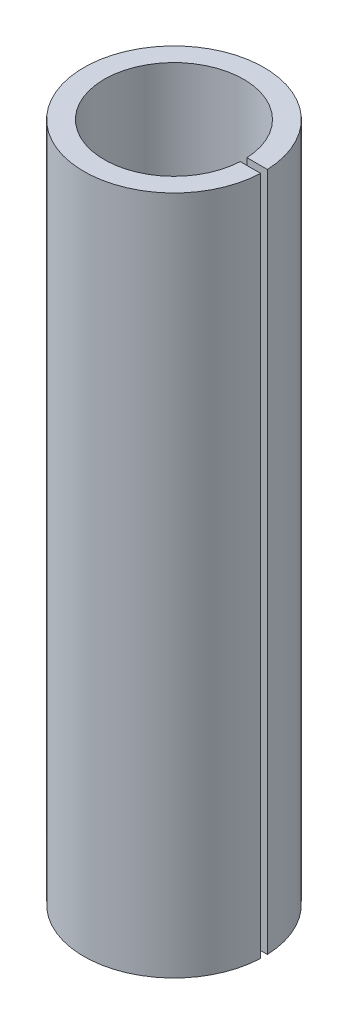
ISO-10303-21;
HEADER;
FILE_DESCRIPTION(('STEP AP214'),'2;1');
FILE_NAME('part.step','',(''),(''),'','','');
FILE_SCHEMA(('AUTOMOTIVE_DESIGN { 1 0 10303 214 1 1 1 1 }'));
ENDSEC;
DATA;
#1=APPLICATION_CONTEXT('core data for automotive mechanical design processes');
#2=APPLICATION_PROTOCOL_DEFINITION('international standard','automotive_design',2000,#1);
#3=PRODUCT_CONTEXT('',#1,'mechanical');
#4=PRODUCT('Part','Part','',(#3));
#5=PRODUCT_RELATED_PRODUCT_CATEGORY('part','',(#4));
#6=PRODUCT_DEFINITION_FORMATION('','',#4);
#7=PRODUCT_DEFINITION_CONTEXT('part definition',#1,'design');
#8=PRODUCT_DEFINITION('design','',#6,#7);
#9=PRODUCT_DEFINITION_SHAPE('','',#8);
#10=(LENGTH_UNIT() NAMED_UNIT(*) SI_UNIT(.MILLI.,.METRE.));
#11=(NAMED_UNIT(*) PLANE_ANGLE_UNIT() SI_UNIT($,.RADIAN.));
#12=(NAMED_UNIT(*) SI_UNIT($,.STERADIAN.) SOLID_ANGLE_UNIT());
#13=UNCERTAINTY_MEASURE_WITH_UNIT(LENGTH_MEASURE(1.E-05),#10,'distance_accuracy_value','');
#14=(GEOMETRIC_REPRESENTATION_CONTEXT(3) GLOBAL_UNCERTAINTY_ASSIGNED_CONTEXT((#13)) GLOBAL_UNIT_ASSIGNED_CONTEXT((#10,
#11,#12)) REPRESENTATION_CONTEXT('',''));
#15=CARTESIAN_POINT('',(0.,0.,0.));
#16=DIRECTION('',(0.,0.,1.));
#17=DIRECTION('',(1.,0.,0.));
#18=AXIS2_PLACEMENT_3D('',#15,#16,#17);
#19=CARTESIAN_POINT('',(2.65,20.,0.));
#20=DIRECTION('',(0.,-1.,0.));
#21=DIRECTION('',(0.,0.,-1.));
#22=AXIS2_PLACEMENT_3D('',#19,#20,#21);
#23=PLANE('',#22);
#24=DIRECTION('',(-1.,0.,0.));
#25=VECTOR('',#24,1.);
#26=CARTESIAN_POINT('',(5.3,20.,0.1));
#27=LINE('',#26,#25);
#28=CARTESIAN_POINT('',(2.64811253537307,20.,0.1));
#29=VERTEX_POINT('',#28);
#30=CARTESIAN_POINT('',(2.04755952294433,20.,0.1));
#31=VERTEX_POINT('',#30);
#32=EDGE_CURVE('E54',#29,#31,#27,.T.);
#33=ORIENTED_EDGE('',*,*,#32,.T.);
#34=CARTESIAN_POINT('',(0.,20.,0.));
#35=DIRECTION('',(0.,1.,0.));
#36=DIRECTION('',(0.,0.,1.));
#37=AXIS2_PLACEMENT_3D('',#34,#35,#36);
#38=CIRCLE('',#37,2.05);
#39=CARTESIAN_POINT('',(2.04755952294433,20.,-0.1));
#40=VERTEX_POINT('',#39);
#41=EDGE_CURVE('E85',#40,#31,#38,.T.);
#42=ORIENTED_EDGE('',*,*,#41,.F.);
#43=DIRECTION('',(-1.,0.,0.));
#44=VECTOR('',#43,1.);
#45=CARTESIAN_POINT('',(5.3,20.,-0.1));
#46=LINE('',#45,#44);
#47=CARTESIAN_POINT('',(2.64811253537307,20.,-0.1));
#48=VERTEX_POINT('',#47);
#49=EDGE_CURVE('E87',#48,#40,#46,.T.);
#50=ORIENTED_EDGE('',*,*,#49,.F.);
#51=CARTESIAN_POINT('',(0.,20.,0.));
#52=DIRECTION('',(0.,1.,0.));
#53=DIRECTION('',(0.,0.,1.));
#54=AXIS2_PLACEMENT_3D('',#51,#52,#53);
#55=CIRCLE('',#54,2.65);
#56=EDGE_CURVE('E78',#48,#29,#55,.T.);
#57=ORIENTED_EDGE('',*,*,#56,.T.);
#58=EDGE_LOOP('',(#33,#42,#50,#57));
#59=FACE_BOUND('',#58,.T.);
#60=ADVANCED_FACE('F33',(#59),#23,.F.);
#61=CARTESIAN_POINT('',(0.,0.,0.));
#62=DIRECTION('',(0.,1.,0.));
#63=DIRECTION('',(0.,0.,1.));
#64=AXIS2_PLACEMENT_3D('',#61,#62,#63);
#65=CYLINDRICAL_SURFACE('',#64,2.05);
#66=DIRECTION('',(0.,1.,0.));
#67=VECTOR('',#66,1.);
#68=CARTESIAN_POINT('',(2.04755952294433,0.,0.1));
#69=LINE('',#68,#67);
#70=CARTESIAN_POINT('',(2.04755952294433,0.,0.1));
#71=VERTEX_POINT('',#70);
#72=EDGE_CURVE('E70',#71,#31,#69,.T.);
#73=ORIENTED_EDGE('',*,*,#72,.F.);
#74=CARTESIAN_POINT('',(0.,0.,0.));
#75=DIRECTION('',(0.,1.,0.));
#76=DIRECTION('',(0.,0.,1.));
#77=AXIS2_PLACEMENT_3D('',#74,#75,#76);
#78=CIRCLE('',#77,2.05);
#79=CARTESIAN_POINT('',(2.04755952294433,0.,-0.1));
#80=VERTEX_POINT('',#79);
#81=EDGE_CURVE('E91',#80,#71,#78,.T.);
#82=ORIENTED_EDGE('',*,*,#81,.F.);
#83=DIRECTION('',(0.,1.,0.));
#84=VECTOR('',#83,1.);
#85=CARTESIAN_POINT('',(2.04755952294433,0.,-0.1));
#86=LINE('',#85,#84);
#87=EDGE_CURVE('E79',#40,#80,#86,.F.);
#88=ORIENTED_EDGE('',*,*,#87,.F.);
#89=ORIENTED_EDGE('',*,*,#41,.T.);
#90=EDGE_LOOP('',(#73,#82,#88,#89));
#91=FACE_BOUND('',#90,.T.);
#92=ADVANCED_FACE('F90',(#91),#65,.F.);
#93=CARTESIAN_POINT('',(2.05,0.,0.));
#94=DIRECTION('',(0.,1.,0.));
#95=DIRECTION('',(0.,0.,1.));
#96=AXIS2_PLACEMENT_3D('',#93,#94,#95);
#97=PLANE('',#96);
#98=DIRECTION('',(-1.,0.,0.));
#99=VECTOR('',#98,1.);
#100=CARTESIAN_POINT('',(5.3,0.,0.1));
#101=LINE('',#100,#99);
#102=CARTESIAN_POINT('',(2.64811253537307,0.,0.1));
#103=VERTEX_POINT('',#102);
#104=EDGE_CURVE('E73',#103,#71,#101,.T.);
#105=ORIENTED_EDGE('',*,*,#104,.F.);
#106=CARTESIAN_POINT('',(0.,0.,0.));
#107=DIRECTION('',(0.,1.,0.));
#108=DIRECTION('',(0.,0.,1.));
#109=AXIS2_PLACEMENT_3D('',#106,#107,#108);
#110=CIRCLE('',#109,2.65);
#111=CARTESIAN_POINT('',(2.64811253537307,0.,-0.1));
#112=VERTEX_POINT('',#111);
#113=EDGE_CURVE('E93',#112,#103,#110,.T.);
#114=ORIENTED_EDGE('',*,*,#113,.F.);
#115=DIRECTION('',(-1.,0.,0.));
#116=VECTOR('',#115,1.);
#117=CARTESIAN_POINT('',(5.3,0.,-0.1));
#118=LINE('',#117,#116);
#119=EDGE_CURVE('E47',#112,#80,#118,.T.);
#120=ORIENTED_EDGE('',*,*,#119,.T.);
#121=ORIENTED_EDGE('',*,*,#81,.T.);
#122=EDGE_LOOP('',(#105,#114,#120,#121));
#123=FACE_BOUND('',#122,.T.);
#124=ADVANCED_FACE('F107',(#123),#97,.F.);
#125=CARTESIAN_POINT('',(0.,0.,0.));
#126=DIRECTION('',(0.,1.,0.));
#127=DIRECTION('',(0.,0.,1.));
#128=AXIS2_PLACEMENT_3D('',#125,#126,#127);
#129=CYLINDRICAL_SURFACE('',#128,2.65);
#130=DIRECTION('',(0.,1.,0.));
#131=VECTOR('',#130,1.);
#132=CARTESIAN_POINT('',(2.64811253537307,0.,0.1));
#133=LINE('',#132,#131);
#134=EDGE_CURVE('E11',#29,#103,#133,.F.);
#135=ORIENTED_EDGE('',*,*,#134,.F.);
#136=ORIENTED_EDGE('',*,*,#56,.F.);
#137=DIRECTION('',(0.,1.,0.));
#138=VECTOR('',#137,1.);
#139=CARTESIAN_POINT('',(2.64811253537307,0.,-0.1));
#140=LINE('',#139,#138);
#141=EDGE_CURVE('E40',#112,#48,#140,.T.);
#142=ORIENTED_EDGE('',*,*,#141,.F.);
#143=ORIENTED_EDGE('',*,*,#113,.T.);
#144=EDGE_LOOP('',(#135,#136,#142,#143));
#145=FACE_BOUND('',#144,.T.);
#146=ADVANCED_FACE('F104',(#145),#129,.T.);
#147=CARTESIAN_POINT('',(5.3,0.,-0.1));
#148=DIRECTION('',(0.,0.,1.));
#149=DIRECTION('',(1.,0.,0.));
#150=AXIS2_PLACEMENT_3D('',#147,#148,#149);
#151=PLANE('',#150);
#152=ORIENTED_EDGE('',*,*,#87,.T.);
#153=ORIENTED_EDGE('',*,*,#119,.F.);
#154=ORIENTED_EDGE('',*,*,#141,.T.);
#155=ORIENTED_EDGE('',*,*,#49,.T.);
#156=EDGE_LOOP('',(#152,#153,#154,#155));
#157=FACE_BOUND('',#156,.T.);
#158=ADVANCED_FACE('F102',(#157),#151,.T.);
#159=CARTESIAN_POINT('',(5.3,20.,0.1));
#160=DIRECTION('',(0.,0.,-1.));
#161=DIRECTION('',(-1.,0.,0.));
#162=AXIS2_PLACEMENT_3D('',#159,#160,#161);
#163=PLANE('',#162);
#164=ORIENTED_EDGE('',*,*,#72,.T.);
#165=ORIENTED_EDGE('',*,*,#32,.F.);
#166=ORIENTED_EDGE('',*,*,#134,.T.);
#167=ORIENTED_EDGE('',*,*,#104,.T.);
#168=EDGE_LOOP('',(#164,#165,#166,#167));
#169=FACE_BOUND('',#168,.T.);
#170=ADVANCED_FACE('F71',(#169),#163,.T.);
#171=CLOSED_SHELL('',(#60,#92,#124,#146,#158,#170));
#172=MANIFOLD_SOLID_BREP('B2',#171);
#173=ADVANCED_BREP_SHAPE_REPRESENTATION('',(#18,#172),#14);
#174=SHAPE_DEFINITION_REPRESENTATION(#9,#173);
ENDSEC;
END-ISO-10303-21;
